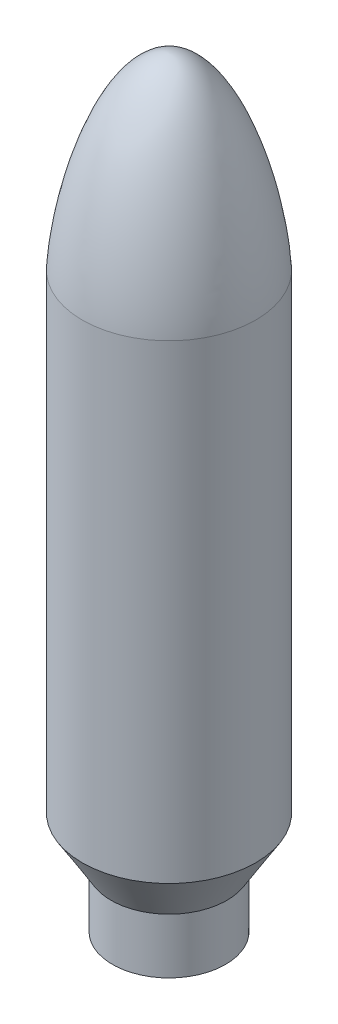
ISO-10303-21;
HEADER;
FILE_DESCRIPTION(('STEP AP214'),'2;1');
FILE_NAME('part.step','',(''),(''),'','','');
FILE_SCHEMA(('AUTOMOTIVE_DESIGN { 1 0 10303 214 1 1 1 1 }'));
ENDSEC;
DATA;
#1=APPLICATION_CONTEXT('core data for automotive mechanical design processes');
#2=APPLICATION_PROTOCOL_DEFINITION('international standard','automotive_design',2000,#1);
#3=PRODUCT_CONTEXT('',#1,'mechanical');
#4=PRODUCT('Part','Part','',(#3));
#5=PRODUCT_RELATED_PRODUCT_CATEGORY('part','',(#4));
#6=PRODUCT_DEFINITION_FORMATION('','',#4);
#7=PRODUCT_DEFINITION_CONTEXT('part definition',#1,'design');
#8=PRODUCT_DEFINITION('design','',#6,#7);
#9=PRODUCT_DEFINITION_SHAPE('','',#8);
#10=(LENGTH_UNIT() NAMED_UNIT(*) SI_UNIT(.MILLI.,.METRE.));
#11=(NAMED_UNIT(*) PLANE_ANGLE_UNIT() SI_UNIT($,.RADIAN.));
#12=(NAMED_UNIT(*) SI_UNIT($,.STERADIAN.) SOLID_ANGLE_UNIT());
#13=UNCERTAINTY_MEASURE_WITH_UNIT(LENGTH_MEASURE(1.E-05),#10,'distance_accuracy_value','');
#14=(GEOMETRIC_REPRESENTATION_CONTEXT(3) GLOBAL_UNCERTAINTY_ASSIGNED_CONTEXT((#13)) GLOBAL_UNIT_ASSIGNED_CONTEXT((#10,
#11,#12)) REPRESENTATION_CONTEXT('',''));
#15=CARTESIAN_POINT('',(0.,0.,0.));
#16=DIRECTION('',(0.,0.,1.));
#17=DIRECTION('',(1.,0.,0.));
#18=AXIS2_PLACEMENT_3D('',#15,#16,#17);
#19=CARTESIAN_POINT('',(-11.065,0.,0.));
#20=DIRECTION('',(0.,1.,0.));
#21=DIRECTION('',(0.,0.,1.));
#22=AXIS2_PLACEMENT_3D('',#19,#20,#21);
#23=PLANE('',#22);
#24=CARTESIAN_POINT('',(0.,0.,0.));
#25=DIRECTION('',(0.,-1.,0.));
#26=DIRECTION('',(0.,0.,-1.));
#27=AXIS2_PLACEMENT_3D('',#24,#25,#26);
#28=CIRCLE('',#27,11.065);
#29=CARTESIAN_POINT('',(0.,0.,-11.065));
#30=VERTEX_POINT('',#29);
#31=EDGE_CURVE('E81',#30,#30,#28,.T.);
#32=ORIENTED_EDGE('',*,*,#31,.F.);
#33=EDGE_LOOP('',(#32));
#34=FACE_BOUND('',#33,.T.);
#35=CARTESIAN_POINT('',(0.,0.,0.));
#36=DIRECTION('',(0.,-1.,0.));
#37=DIRECTION('',(0.,0.,-1.));
#38=AXIS2_PLACEMENT_3D('',#35,#36,#37);
#39=CIRCLE('',#38,12.065);
#40=CARTESIAN_POINT('',(0.,0.,-12.065));
#41=VERTEX_POINT('',#40);
#42=EDGE_CURVE('E11',#41,#41,#39,.T.);
#43=ORIENTED_EDGE('',*,*,#42,.T.);
#44=EDGE_LOOP('',(#43));
#45=FACE_BOUND('',#44,.T.);
#46=ADVANCED_FACE('F47',(#34,#45),#23,.F.);
#47=CARTESIAN_POINT('',(0.,0.,0.));
#48=DIRECTION('',(0.,-1.,0.));
#49=DIRECTION('',(0.,0.,-1.));
#50=AXIS2_PLACEMENT_3D('',#47,#48,#49);
#51=CYLINDRICAL_SURFACE('',#50,12.065);
#52=ORIENTED_EDGE('',*,*,#42,.F.);
#53=EDGE_LOOP('',(#52));
#54=FACE_BOUND('',#53,.T.);
#55=CARTESIAN_POINT('',(0.,12.,0.));
#56=DIRECTION('',(0.,-1.,0.));
#57=DIRECTION('',(0.,0.,-1.));
#58=AXIS2_PLACEMENT_3D('',#55,#56,#57);
#59=CIRCLE('',#58,12.065);
#60=CARTESIAN_POINT('',(0.,12.,-12.065));
#61=VERTEX_POINT('',#60);
#62=EDGE_CURVE('E53',#61,#61,#59,.T.);
#63=ORIENTED_EDGE('',*,*,#62,.T.);
#64=EDGE_LOOP('',(#63));
#65=FACE_BOUND('',#64,.T.);
#66=ADVANCED_FACE('F88',(#54,#65),#51,.T.);
#67=CARTESIAN_POINT('',(-12.065,12.,0.));
#68=DIRECTION('',(0.,1.,0.));
#69=DIRECTION('',(0.,0.,1.));
#70=AXIS2_PLACEMENT_3D('',#67,#68,#69);
#71=PLANE('',#70);
#72=ORIENTED_EDGE('',*,*,#62,.F.);
#73=EDGE_LOOP('',(#72));
#74=FACE_BOUND('',#73,.T.);
#75=CARTESIAN_POINT('',(0.,12.,0.));
#76=DIRECTION('',(0.,-1.,0.));
#77=DIRECTION('',(0.,0.,-1.));
#78=AXIS2_PLACEMENT_3D('',#75,#76,#77);
#79=CIRCLE('',#78,12.369);
#80=CARTESIAN_POINT('',(0.,12.,-12.369));
#81=VERTEX_POINT('',#80);
#82=EDGE_CURVE('E57',#81,#81,#79,.T.);
#83=ORIENTED_EDGE('',*,*,#82,.T.);
#84=EDGE_LOOP('',(#83));
#85=FACE_BOUND('',#84,.T.);
#86=ADVANCED_FACE('F92',(#74,#85),#71,.F.);
#87=CARTESIAN_POINT('',(0.,22.,0.));
#88=DIRECTION('',(0.,1.,0.));
#89=DIRECTION('',(0.,0.,1.));
#90=AXIS2_PLACEMENT_3D('',#87,#88,#89);
#91=CONICAL_SURFACE('',#90,18.5,0.549996210983491);
#92=ORIENTED_EDGE('',*,*,#82,.F.);
#93=EDGE_LOOP('',(#92));
#94=FACE_BOUND('',#93,.T.);
#95=CARTESIAN_POINT('',(0.,22.,0.));
#96=DIRECTION('',(0.,-1.,0.));
#97=DIRECTION('',(0.,0.,-1.));
#98=AXIS2_PLACEMENT_3D('',#95,#96,#97);
#99=CIRCLE('',#98,18.5);
#100=CARTESIAN_POINT('',(0.,22.,-18.5));
#101=VERTEX_POINT('',#100);
#102=EDGE_CURVE('E61',#101,#101,#99,.T.);
#103=ORIENTED_EDGE('',*,*,#102,.T.);
#104=EDGE_LOOP('',(#103));
#105=FACE_BOUND('',#104,.T.);
#106=ADVANCED_FACE('F97',(#94,#105),#91,.T.);
#107=CARTESIAN_POINT('',(0.,0.,0.));
#108=DIRECTION('',(0.,-1.,0.));
#109=DIRECTION('',(0.,0.,-1.));
#110=AXIS2_PLACEMENT_3D('',#107,#108,#109);
#111=CYLINDRICAL_SURFACE('',#110,18.5);
#112=ORIENTED_EDGE('',*,*,#102,.F.);
#113=EDGE_LOOP('',(#112));
#114=FACE_BOUND('',#113,.T.);
#115=CARTESIAN_POINT('',(0.,122.282146570095,0.));
#116=DIRECTION('',(0.,-1.,0.));
#117=DIRECTION('',(0.,0.,-1.));
#118=AXIS2_PLACEMENT_3D('',#115,#116,#117);
#119=CIRCLE('',#118,18.5);
#120=CARTESIAN_POINT('',(0.,122.282146570095,-18.5));
#121=VERTEX_POINT('',#120);
#122=EDGE_CURVE('E66',#121,#121,#119,.T.);
#123=ORIENTED_EDGE('',*,*,#122,.T.);
#124=EDGE_LOOP('',(#123));
#125=FACE_BOUND('',#124,.T.);
#126=ADVANCED_FACE('F103',(#114,#125),#111,.T.);
#127=CARTESIAN_POINT('',(-18.5,122.282146570095,0.));
#128=DIRECTION('',(0.,-1.,0.));
#129=DIRECTION('',(0.,0.,-1.));
#130=AXIS2_PLACEMENT_3D('',#127,#128,#129);
#131=PLANE('',#130);
#132=ORIENTED_EDGE('',*,*,#122,.F.);
#133=EDGE_LOOP('',(#132));
#134=FACE_BOUND('',#133,.T.);
#135=CARTESIAN_POINT('',(0.,122.282146570095,0.));
#136=DIRECTION('',(0.,-1.,0.));
#137=DIRECTION('',(0.,0.,-1.));
#138=AXIS2_PLACEMENT_3D('',#135,#136,#137);
#139=CIRCLE('',#138,17.5);
#140=CARTESIAN_POINT('',(0.,122.282146570095,-17.5));
#141=VERTEX_POINT('',#140);
#142=EDGE_CURVE('E69',#141,#141,#139,.T.);
#143=ORIENTED_EDGE('',*,*,#142,.T.);
#144=EDGE_LOOP('',(#143));
#145=FACE_BOUND('',#144,.T.);
#146=ADVANCED_FACE('F107',(#134,#145),#131,.F.);
#147=CARTESIAN_POINT('',(0.,0.,0.));
#148=DIRECTION('',(0.,-1.,0.));
#149=DIRECTION('',(0.,0.,-1.));
#150=AXIS2_PLACEMENT_3D('',#147,#148,#149);
#151=CYLINDRICAL_SURFACE('',#150,17.5);
#152=ORIENTED_EDGE('',*,*,#142,.F.);
#153=EDGE_LOOP('',(#152));
#154=FACE_BOUND('',#153,.T.);
#155=CARTESIAN_POINT('',(0.,22.2821465700951,0.));
#156=DIRECTION('',(0.,-1.,0.));
#157=DIRECTION('',(0.,0.,-1.));
#158=AXIS2_PLACEMENT_3D('',#155,#156,#157);
#159=CIRCLE('',#158,17.5);
#160=CARTESIAN_POINT('',(0.,22.2821465700951,-17.5));
#161=VERTEX_POINT('',#160);
#162=EDGE_CURVE('E72',#161,#161,#159,.T.);
#163=ORIENTED_EDGE('',*,*,#162,.T.);
#164=EDGE_LOOP('',(#163));
#165=FACE_BOUND('',#164,.T.);
#166=ADVANCED_FACE('F111',(#154,#165),#151,.F.);
#167=CARTESIAN_POINT('',(0.,13.,0.));
#168=DIRECTION('',(0.,1.,0.));
#169=DIRECTION('',(0.,0.,1.));
#170=AXIS2_PLACEMENT_3D('',#167,#168,#169);
#171=CONICAL_SURFACE('',#170,11.8091159378747,0.549996210983491);
#172=ORIENTED_EDGE('',*,*,#162,.F.);
#173=EDGE_LOOP('',(#172));
#174=FACE_BOUND('',#173,.T.);
#175=CARTESIAN_POINT('',(0.,13.,0.));
#176=DIRECTION('',(0.,-1.,0.));
#177=DIRECTION('',(0.,0.,-1.));
#178=AXIS2_PLACEMENT_3D('',#175,#176,#177);
#179=CIRCLE('',#178,11.8091159378747);
#180=CARTESIAN_POINT('',(0.,13.,-11.8091159378747));
#181=VERTEX_POINT('',#180);
#182=EDGE_CURVE('E75',#181,#181,#179,.T.);
#183=ORIENTED_EDGE('',*,*,#182,.T.);
#184=EDGE_LOOP('',(#183));
#185=FACE_BOUND('',#184,.T.);
#186=ADVANCED_FACE('F115',(#174,#185),#171,.F.);
#187=CARTESIAN_POINT('',(-11.8091159378747,13.,0.));
#188=DIRECTION('',(0.,-1.,0.));
#189=DIRECTION('',(0.,0.,-1.));
#190=AXIS2_PLACEMENT_3D('',#187,#188,#189);
#191=PLANE('',#190);
#192=ORIENTED_EDGE('',*,*,#182,.F.);
#193=EDGE_LOOP('',(#192));
#194=FACE_BOUND('',#193,.T.);
#195=CARTESIAN_POINT('',(0.,13.,0.));
#196=DIRECTION('',(0.,-1.,0.));
#197=DIRECTION('',(0.,0.,-1.));
#198=AXIS2_PLACEMENT_3D('',#195,#196,#197);
#199=CIRCLE('',#198,11.065);
#200=CARTESIAN_POINT('',(0.,13.,-11.065));
#201=VERTEX_POINT('',#200);
#202=EDGE_CURVE('E78',#201,#201,#199,.T.);
#203=ORIENTED_EDGE('',*,*,#202,.T.);
#204=EDGE_LOOP('',(#203));
#205=FACE_BOUND('',#204,.T.);
#206=ADVANCED_FACE('F119',(#194,#205),#191,.F.);
#207=CARTESIAN_POINT('',(0.,0.,0.));
#208=DIRECTION('',(0.,-1.,0.));
#209=DIRECTION('',(0.,0.,-1.));
#210=AXIS2_PLACEMENT_3D('',#207,#208,#209);
#211=CYLINDRICAL_SURFACE('',#210,11.065);
#212=ORIENTED_EDGE('',*,*,#202,.F.);
#213=EDGE_LOOP('',(#212));
#214=FACE_BOUND('',#213,.T.);
#215=ORIENTED_EDGE('',*,*,#31,.T.);
#216=EDGE_LOOP('',(#215));
#217=FACE_BOUND('',#216,.T.);
#218=ADVANCED_FACE('F85',(#214,#217),#211,.F.);
#219=CLOSED_SHELL('',(#46,#66,#86,#106,#126,#146,#166,#186,#206,#218));
#220=MANIFOLD_SOLID_BREP('B2',#219);
#221=CARTESIAN_POINT('',(0.,162.282146570095,0.));
#222=CARTESIAN_POINT('',(-10.5217958722297,161.697040147877,0.));
#223=CARTESIAN_POINT('',(-17.7085537289469,136.992560015411,0.));
#224=CARTESIAN_POINT('',(-18.5,122.282146570095,0.));
#225=B_SPLINE_CURVE_WITH_KNOTS('',3,(#221,#222,#223,#224),.UNSPECIFIED.,.F.,.F.,(4,4),(0.,1.),.UNSPECIFIED.);
#226=CARTESIAN_POINT('',(0.,122.282146570095,0.));
#227=DIRECTION('',(0.,-1.,0.));
#228=AXIS1_PLACEMENT('',#226,#227);
#229=SURFACE_OF_REVOLUTION('',#225,#228);
#230=CARTESIAN_POINT('',(0.,122.282146570095,0.));
#231=DIRECTION('',(0.,-1.,0.));
#232=DIRECTION('',(0.,0.,-1.));
#233=AXIS2_PLACEMENT_3D('',#230,#231,#232);
#234=CIRCLE('',#233,18.5);
#235=CARTESIAN_POINT('',(0.,122.282146570095,-18.5));
#236=VERTEX_POINT('',#235);
#237=EDGE_CURVE('E45',#236,#236,#234,.T.);
#238=ORIENTED_EDGE('',*,*,#237,.F.);
#239=EDGE_LOOP('',(#238));
#240=FACE_BOUND('',#239,.T.);
#241=CARTESIAN_POINT('',(0.,162.282146570095,0.));
#242=VERTEX_POINT('',#241);
#243=VERTEX_LOOP('',#242);
#244=FACE_BOUND('',#243,.T.);
#245=ADVANCED_FACE('F198',(#240,#244),#229,.T.);
#246=CARTESIAN_POINT('',(-17.3,122.282146570095,0.));
#247=DIRECTION('',(0.,1.,0.));
#248=DIRECTION('',(0.,0.,1.));
#249=AXIS2_PLACEMENT_3D('',#246,#247,#248);
#250=PLANE('',#249);
#251=CARTESIAN_POINT('',(0.,122.282146570095,0.));
#252=DIRECTION('',(0.,-1.,0.));
#253=DIRECTION('',(0.,0.,-1.));
#254=AXIS2_PLACEMENT_3D('',#251,#252,#253);
#255=CIRCLE('',#254,17.3);
#256=CARTESIAN_POINT('',(0.,122.282146570095,-17.3));
#257=VERTEX_POINT('',#256);
#258=EDGE_CURVE('E205',#257,#257,#255,.T.);
#259=ORIENTED_EDGE('',*,*,#258,.F.);
#260=EDGE_LOOP('',(#259));
#261=FACE_BOUND('',#260,.T.);
#262=ORIENTED_EDGE('',*,*,#237,.T.);
#263=EDGE_LOOP('',(#262));
#264=FACE_BOUND('',#263,.T.);
#265=ADVANCED_FACE('F209',(#261,#264),#250,.F.);
#266=CARTESIAN_POINT('',(0.,122.282146570095,0.));
#267=DIRECTION('',(0.,-1.,0.));
#268=DIRECTION('',(0.,0.,-1.));
#269=AXIS2_PLACEMENT_3D('',#266,#267,#268);
#270=CYLINDRICAL_SURFACE('',#269,17.3);
#271=CARTESIAN_POINT('',(0.,119.282146570095,0.));
#272=DIRECTION('',(0.,-1.,0.));
#273=DIRECTION('',(0.,0.,-1.));
#274=AXIS2_PLACEMENT_3D('',#271,#272,#273);
#275=CIRCLE('',#274,17.3);
#276=CARTESIAN_POINT('',(0.,119.282146570095,-17.3));
#277=VERTEX_POINT('',#276);
#278=EDGE_CURVE('E237',#277,#277,#275,.T.);
#279=ORIENTED_EDGE('',*,*,#278,.F.);
#280=EDGE_LOOP('',(#279));
#281=FACE_BOUND('',#280,.T.);
#282=ORIENTED_EDGE('',*,*,#258,.T.);
#283=EDGE_LOOP('',(#282));
#284=FACE_BOUND('',#283,.T.);
#285=ADVANCED_FACE('F214',(#281,#284),#270,.T.);
#286=CARTESIAN_POINT('',(0.,119.282146570095,0.));
#287=DIRECTION('',(0.,1.,0.));
#288=DIRECTION('',(0.,0.,1.));
#289=AXIS2_PLACEMENT_3D('',#286,#287,#288);
#290=CONICAL_SURFACE('',#289,17.3,0.785398163397448);
#291=CARTESIAN_POINT('',(0.,118.282146570095,0.));
#292=DIRECTION('',(0.,-1.,0.));
#293=DIRECTION('',(0.,0.,-1.));
#294=AXIS2_PLACEMENT_3D('',#291,#292,#293);
#295=CIRCLE('',#294,16.3);
#296=CARTESIAN_POINT('',(0.,118.282146570095,-16.3));
#297=VERTEX_POINT('',#296);
#298=EDGE_CURVE('E236',#297,#297,#295,.T.);
#299=ORIENTED_EDGE('',*,*,#298,.F.);
#300=EDGE_LOOP('',(#299));
#301=FACE_BOUND('',#300,.T.);
#302=ORIENTED_EDGE('',*,*,#278,.T.);
#303=EDGE_LOOP('',(#302));
#304=FACE_BOUND('',#303,.T.);
#305=ADVANCED_FACE('F221',(#301,#304),#290,.T.);
#306=CARTESIAN_POINT('',(0.,118.282146570095,0.));
#307=DIRECTION('',(0.,1.,0.));
#308=DIRECTION('',(0.,0.,1.));
#309=AXIS2_PLACEMENT_3D('',#306,#307,#308);
#310=PLANE('',#309);
#311=ORIENTED_EDGE('',*,*,#298,.T.);
#312=EDGE_LOOP('',(#311));
#313=FACE_BOUND('',#312,.T.);
#314=ADVANCED_FACE('F228',(#313),#310,.F.);
#315=CLOSED_SHELL('',(#245,#265,#285,#305,#314));
#316=MANIFOLD_SOLID_BREP('B6',#315);
#317=ADVANCED_BREP_SHAPE_REPRESENTATION('',(#18,#220,#316),#14);
#318=SHAPE_DEFINITION_REPRESENTATION(#9,#317);
ENDSEC;
END-ISO-10303-21;
